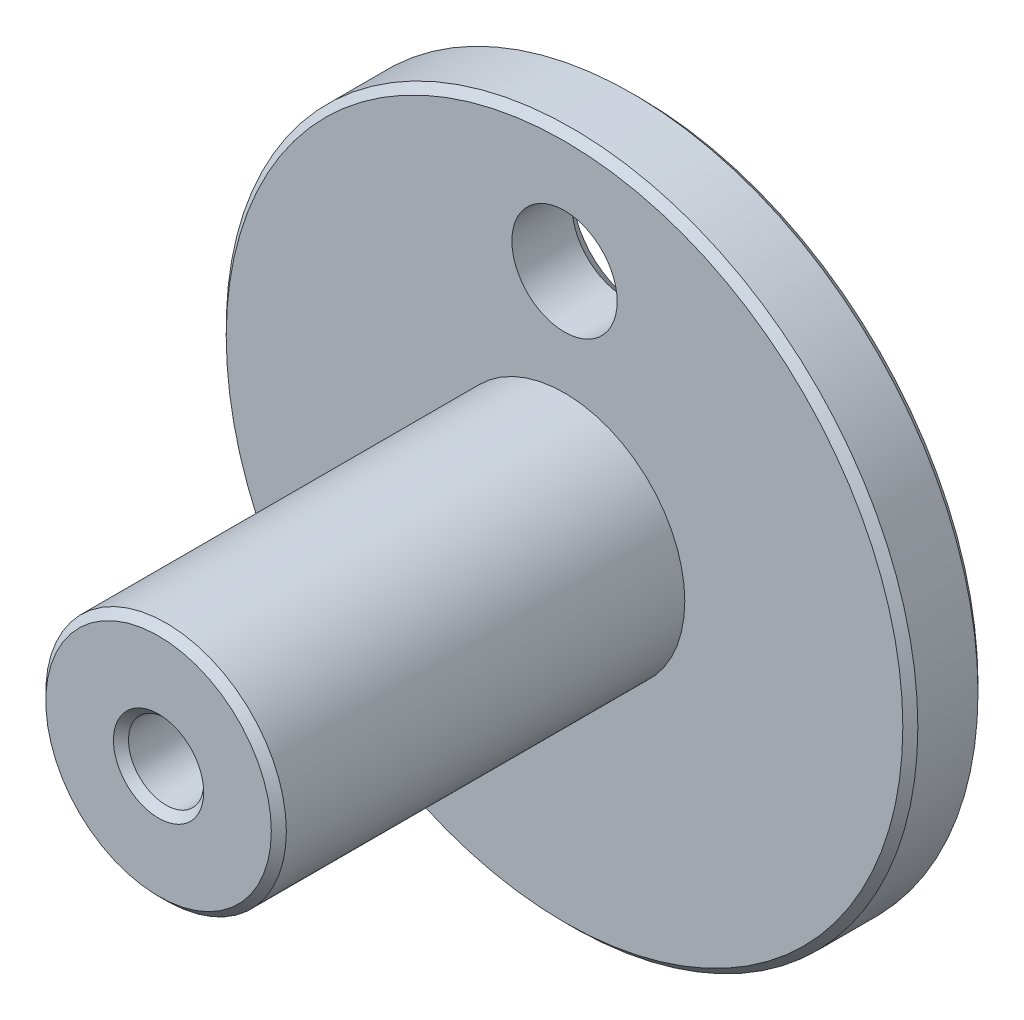
ISO-10303-21;
HEADER;
FILE_DESCRIPTION(('STEP AP214'),'2;1');
FILE_NAME('part.step','',(''),(''),'','','');
FILE_SCHEMA(('AUTOMOTIVE_DESIGN { 1 0 10303 214 1 1 1 1 }'));
ENDSEC;
DATA;
#1=APPLICATION_CONTEXT('core data for automotive mechanical design processes');
#2=APPLICATION_PROTOCOL_DEFINITION('international standard','automotive_design',2000,#1);
#3=PRODUCT_CONTEXT('',#1,'mechanical');
#4=PRODUCT('Part','Part','',(#3));
#5=PRODUCT_RELATED_PRODUCT_CATEGORY('part','',(#4));
#6=PRODUCT_DEFINITION_FORMATION('','',#4);
#7=PRODUCT_DEFINITION_CONTEXT('part definition',#1,'design');
#8=PRODUCT_DEFINITION('design','',#6,#7);
#9=PRODUCT_DEFINITION_SHAPE('','',#8);
#10=(LENGTH_UNIT() NAMED_UNIT(*) SI_UNIT(.MILLI.,.METRE.));
#11=(NAMED_UNIT(*) PLANE_ANGLE_UNIT() SI_UNIT($,.RADIAN.));
#12=(NAMED_UNIT(*) SI_UNIT($,.STERADIAN.) SOLID_ANGLE_UNIT());
#13=UNCERTAINTY_MEASURE_WITH_UNIT(LENGTH_MEASURE(1.E-05),#10,'distance_accuracy_value','');
#14=(GEOMETRIC_REPRESENTATION_CONTEXT(3) GLOBAL_UNCERTAINTY_ASSIGNED_CONTEXT((#13)) GLOBAL_UNIT_ASSIGNED_CONTEXT((#10,
#11,#12)) REPRESENTATION_CONTEXT('',''));
#15=CARTESIAN_POINT('',(0.,0.,0.));
#16=DIRECTION('',(0.,0.,1.));
#17=DIRECTION('',(1.,0.,0.));
#18=AXIS2_PLACEMENT_3D('',#15,#16,#17);
#19=CARTESIAN_POINT('',(0.,0.,5.));
#20=DIRECTION('',(0.,0.,1.));
#21=DIRECTION('',(1.,0.,0.));
#22=AXIS2_PLACEMENT_3D('',#19,#20,#21);
#23=PLANE('',#22);
#24=CARTESIAN_POINT('',(0.,0.,5.));
#25=DIRECTION('',(0.,0.,1.));
#26=DIRECTION('',(1.,0.,0.));
#27=AXIS2_PLACEMENT_3D('',#24,#25,#26);
#28=CIRCLE('',#27,22.5);
#29=CARTESIAN_POINT('',(22.5,0.,5.));
#30=VERTEX_POINT('',#29);
#31=EDGE_CURVE('E10',#30,#30,#28,.T.);
#32=ORIENTED_EDGE('',*,*,#31,.T.);
#33=EDGE_LOOP('',(#32));
#34=FACE_BOUND('',#33,.T.);
#35=CARTESIAN_POINT('',(0.,0.,5.));
#36=DIRECTION('',(0.,0.,1.));
#37=DIRECTION('',(1.,0.,0.));
#38=AXIS2_PLACEMENT_3D('',#35,#36,#37);
#39=CIRCLE('',#38,8.);
#40=CARTESIAN_POINT('',(8.,0.,5.));
#41=VERTEX_POINT('',#40);
#42=EDGE_CURVE('E82',#41,#41,#39,.T.);
#43=ORIENTED_EDGE('',*,*,#42,.F.);
#44=EDGE_LOOP('',(#43));
#45=FACE_BOUND('',#44,.T.);
#46=CARTESIAN_POINT('',(0.,15.,5.));
#47=DIRECTION('',(0.,0.,1.));
#48=DIRECTION('',(1.,0.,0.));
#49=AXIS2_PLACEMENT_3D('',#46,#47,#48);
#50=CIRCLE('',#49,3.5);
#51=CARTESIAN_POINT('',(3.5,15.,5.));
#52=VERTEX_POINT('',#51);
#53=EDGE_CURVE('E86',#52,#52,#50,.T.);
#54=ORIENTED_EDGE('',*,*,#53,.F.);
#55=EDGE_LOOP('',(#54));
#56=FACE_BOUND('',#55,.T.);
#57=ADVANCED_FACE('F41',(#34,#45,#56),#23,.T.);
#58=CARTESIAN_POINT('',(0.,0.,0.));
#59=DIRECTION('',(0.,0.,1.));
#60=DIRECTION('',(1.,0.,0.));
#61=AXIS2_PLACEMENT_3D('',#58,#59,#60);
#62=PLANE('',#61);
#63=CARTESIAN_POINT('',(0.,15.,0.));
#64=DIRECTION('',(0.,0.,-1.));
#65=DIRECTION('',(-1.,0.,0.));
#66=AXIS2_PLACEMENT_3D('',#63,#64,#65);
#67=CIRCLE('',#66,4.5);
#68=CARTESIAN_POINT('',(-4.5,15.,0.));
#69=VERTEX_POINT('',#68);
#70=EDGE_CURVE('E98',#69,#69,#67,.T.);
#71=ORIENTED_EDGE('',*,*,#70,.F.);
#72=EDGE_LOOP('',(#71));
#73=FACE_BOUND('',#72,.T.);
#74=CARTESIAN_POINT('',(0.,0.,0.));
#75=DIRECTION('',(0.,0.,1.));
#76=DIRECTION('',(1.,0.,0.));
#77=AXIS2_PLACEMENT_3D('',#74,#75,#76);
#78=CIRCLE('',#77,22.5);
#79=CARTESIAN_POINT('',(22.5,0.,0.));
#80=VERTEX_POINT('',#79);
#81=EDGE_CURVE('E50',#80,#80,#78,.F.);
#82=ORIENTED_EDGE('',*,*,#81,.T.);
#83=EDGE_LOOP('',(#82));
#84=FACE_BOUND('',#83,.T.);
#85=CARTESIAN_POINT('',(0.,0.,0.));
#86=DIRECTION('',(0.,0.,1.));
#87=DIRECTION('',(1.,0.,0.));
#88=AXIS2_PLACEMENT_3D('',#85,#86,#87);
#89=CIRCLE('',#88,2.5);
#90=CARTESIAN_POINT('',(2.5,0.,0.));
#91=VERTEX_POINT('',#90);
#92=EDGE_CURVE('E90',#91,#91,#89,.T.);
#93=ORIENTED_EDGE('',*,*,#92,.T.);
#94=EDGE_LOOP('',(#93));
#95=FACE_BOUND('',#94,.T.);
#96=ADVANCED_FACE('F105',(#73,#84,#95),#62,.F.);
#97=CARTESIAN_POINT('',(0.,0.,5.));
#98=DIRECTION('',(0.,0.,-1.));
#99=DIRECTION('',(-1.,0.,0.));
#100=AXIS2_PLACEMENT_3D('',#97,#98,#99);
#101=CYLINDRICAL_SURFACE('',#100,23.);
#102=CARTESIAN_POINT('',(0.,0.,0.499999999999994));
#103=DIRECTION('',(0.,0.,1.));
#104=DIRECTION('',(1.,0.,0.));
#105=AXIS2_PLACEMENT_3D('',#102,#103,#104);
#106=CIRCLE('',#105,23.);
#107=CARTESIAN_POINT('',(23.,0.,0.499999999999994));
#108=VERTEX_POINT('',#107);
#109=EDGE_CURVE('E55',#108,#108,#106,.T.);
#110=ORIENTED_EDGE('',*,*,#109,.T.);
#111=EDGE_LOOP('',(#110));
#112=FACE_BOUND('',#111,.T.);
#113=CARTESIAN_POINT('',(0.,0.,4.49999999999999));
#114=DIRECTION('',(0.,0.,1.));
#115=DIRECTION('',(1.,0.,0.));
#116=AXIS2_PLACEMENT_3D('',#113,#114,#115);
#117=CIRCLE('',#116,23.);
#118=CARTESIAN_POINT('',(23.,0.,4.49999999999999));
#119=VERTEX_POINT('',#118);
#120=EDGE_CURVE('E60',#119,#119,#117,.F.);
#121=ORIENTED_EDGE('',*,*,#120,.T.);
#122=EDGE_LOOP('',(#121));
#123=FACE_BOUND('',#122,.T.);
#124=ADVANCED_FACE('F107',(#112,#123),#101,.T.);
#125=CARTESIAN_POINT('',(0.,15.,5.));
#126=DIRECTION('',(0.,0.,-1.));
#127=DIRECTION('',(-1.,0.,0.));
#128=AXIS2_PLACEMENT_3D('',#125,#126,#127);
#129=CYLINDRICAL_SURFACE('',#128,3.5);
#130=CARTESIAN_POINT('',(0.,15.,1.00000000000003));
#131=DIRECTION('',(0.,0.,-1.));
#132=DIRECTION('',(-1.,0.,0.));
#133=AXIS2_PLACEMENT_3D('',#130,#131,#132);
#134=CIRCLE('',#133,3.49999999999999);
#135=CARTESIAN_POINT('',(-3.49999999999999,15.,1.00000000000003));
#136=VERTEX_POINT('',#135);
#137=EDGE_CURVE('E94',#136,#136,#134,.T.);
#138=ORIENTED_EDGE('',*,*,#137,.T.);
#139=EDGE_LOOP('',(#138));
#140=FACE_BOUND('',#139,.T.);
#141=ORIENTED_EDGE('',*,*,#53,.T.);
#142=EDGE_LOOP('',(#141));
#143=FACE_BOUND('',#142,.T.);
#144=ADVANCED_FACE('F135',(#140,#143),#129,.F.);
#145=CARTESIAN_POINT('',(0.,0.,32.));
#146=DIRECTION('',(0.,0.,-1.));
#147=DIRECTION('',(-1.,0.,0.));
#148=AXIS2_PLACEMENT_3D('',#145,#146,#147);
#149=CYLINDRICAL_SURFACE('',#148,8.);
#150=CARTESIAN_POINT('',(0.,0.,31.5));
#151=DIRECTION('',(0.,0.,1.));
#152=DIRECTION('',(1.,0.,0.));
#153=AXIS2_PLACEMENT_3D('',#150,#151,#152);
#154=CIRCLE('',#153,8.);
#155=CARTESIAN_POINT('',(8.,0.,31.5));
#156=VERTEX_POINT('',#155);
#157=EDGE_CURVE('E70',#156,#156,#154,.F.);
#158=ORIENTED_EDGE('',*,*,#157,.T.);
#159=EDGE_LOOP('',(#158));
#160=FACE_BOUND('',#159,.T.);
#161=ORIENTED_EDGE('',*,*,#42,.T.);
#162=EDGE_LOOP('',(#161));
#163=FACE_BOUND('',#162,.T.);
#164=ADVANCED_FACE('F125',(#160,#163),#149,.T.);
#165=CARTESIAN_POINT('',(0.,0.,32.));
#166=DIRECTION('',(0.,0.,1.));
#167=DIRECTION('',(1.,0.,0.));
#168=AXIS2_PLACEMENT_3D('',#165,#166,#167);
#169=PLANE('',#168);
#170=CARTESIAN_POINT('',(0.,0.,32.));
#171=DIRECTION('',(0.,0.,1.));
#172=DIRECTION('',(1.,0.,0.));
#173=AXIS2_PLACEMENT_3D('',#170,#171,#172);
#174=CIRCLE('',#173,7.50000000000001);
#175=CARTESIAN_POINT('',(7.50000000000001,0.,32.));
#176=VERTEX_POINT('',#175);
#177=EDGE_CURVE('E74',#176,#176,#174,.T.);
#178=ORIENTED_EDGE('',*,*,#177,.T.);
#179=EDGE_LOOP('',(#178));
#180=FACE_BOUND('',#179,.T.);
#181=CARTESIAN_POINT('',(0.,0.,32.));
#182=DIRECTION('',(0.,0.,1.));
#183=DIRECTION('',(1.,0.,0.));
#184=AXIS2_PLACEMENT_3D('',#181,#182,#183);
#185=CIRCLE('',#184,2.99999999999999);
#186=CARTESIAN_POINT('',(2.99999999999999,0.,32.));
#187=VERTEX_POINT('',#186);
#188=EDGE_CURVE('E78',#187,#187,#185,.F.);
#189=ORIENTED_EDGE('',*,*,#188,.T.);
#190=EDGE_LOOP('',(#189));
#191=FACE_BOUND('',#190,.T.);
#192=ADVANCED_FACE('F115',(#180,#191),#169,.T.);
#193=CARTESIAN_POINT('',(0.,0.,-5.));
#194=DIRECTION('',(0.,0.,1.));
#195=DIRECTION('',(1.,0.,0.));
#196=AXIS2_PLACEMENT_3D('',#193,#194,#195);
#197=CYLINDRICAL_SURFACE('',#196,2.5);
#198=CARTESIAN_POINT('',(0.,0.,31.5));
#199=DIRECTION('',(0.,0.,1.));
#200=DIRECTION('',(1.,0.,0.));
#201=AXIS2_PLACEMENT_3D('',#198,#199,#200);
#202=CIRCLE('',#201,2.5);
#203=CARTESIAN_POINT('',(2.5,0.,31.5));
#204=VERTEX_POINT('',#203);
#205=EDGE_CURVE('E66',#204,#204,#202,.T.);
#206=ORIENTED_EDGE('',*,*,#205,.T.);
#207=EDGE_LOOP('',(#206));
#208=FACE_BOUND('',#207,.T.);
#209=ORIENTED_EDGE('',*,*,#92,.F.);
#210=EDGE_LOOP('',(#209));
#211=FACE_BOUND('',#210,.T.);
#212=ADVANCED_FACE('F112',(#208,#211),#197,.F.);
#213=CARTESIAN_POINT('',(0.,0.,32.));
#214=DIRECTION('',(0.,0.,-1.));
#215=DIRECTION('',(-1.,0.,0.));
#216=AXIS2_PLACEMENT_3D('',#213,#214,#215);
#217=CONICAL_SURFACE('',#216,7.50000000000001,0.785398163397441);
#218=ORIENTED_EDGE('',*,*,#157,.F.);
#219=EDGE_LOOP('',(#218));
#220=FACE_BOUND('',#219,.T.);
#221=ORIENTED_EDGE('',*,*,#177,.F.);
#222=EDGE_LOOP('',(#221));
#223=FACE_BOUND('',#222,.T.);
#224=ADVANCED_FACE('F114',(#220,#223),#217,.T.);
#225=CARTESIAN_POINT('',(0.,0.,31.5));
#226=DIRECTION('',(0.,0.,1.));
#227=DIRECTION('',(1.,0.,0.));
#228=AXIS2_PLACEMENT_3D('',#225,#226,#227);
#229=CONICAL_SURFACE('',#228,2.5,0.785398163397444);
#230=ORIENTED_EDGE('',*,*,#188,.F.);
#231=EDGE_LOOP('',(#230));
#232=FACE_BOUND('',#231,.T.);
#233=ORIENTED_EDGE('',*,*,#205,.F.);
#234=EDGE_LOOP('',(#233));
#235=FACE_BOUND('',#234,.T.);
#236=ADVANCED_FACE('F122',(#232,#235),#229,.F.);
#237=CARTESIAN_POINT('',(0.,0.,0.499999999999994));
#238=DIRECTION('',(0.,0.,1.));
#239=DIRECTION('',(1.,0.,0.));
#240=AXIS2_PLACEMENT_3D('',#237,#238,#239);
#241=CONICAL_SURFACE('',#240,23.,0.785398163397455);
#242=ORIENTED_EDGE('',*,*,#81,.F.);
#243=EDGE_LOOP('',(#242));
#244=FACE_BOUND('',#243,.T.);
#245=ORIENTED_EDGE('',*,*,#109,.F.);
#246=EDGE_LOOP('',(#245));
#247=FACE_BOUND('',#246,.T.);
#248=ADVANCED_FACE('F149',(#244,#247),#241,.T.);
#249=CARTESIAN_POINT('',(0.,0.,5.));
#250=DIRECTION('',(0.,0.,-1.));
#251=DIRECTION('',(-1.,0.,0.));
#252=AXIS2_PLACEMENT_3D('',#249,#250,#251);
#253=CONICAL_SURFACE('',#252,22.5,0.785398163397434);
#254=ORIENTED_EDGE('',*,*,#120,.F.);
#255=EDGE_LOOP('',(#254));
#256=FACE_BOUND('',#255,.T.);
#257=ORIENTED_EDGE('',*,*,#31,.F.);
#258=EDGE_LOOP('',(#257));
#259=FACE_BOUND('',#258,.T.);
#260=ADVANCED_FACE('F44',(#256,#259),#253,.T.);
#261=CARTESIAN_POINT('',(0.,15.,0.));
#262=DIRECTION('',(0.,0.,-1.));
#263=DIRECTION('',(-1.,0.,0.));
#264=AXIS2_PLACEMENT_3D('',#261,#262,#263);
#265=CONICAL_SURFACE('',#264,4.5,0.78539816339744);
#266=ORIENTED_EDGE('',*,*,#137,.F.);
#267=EDGE_LOOP('',(#266));
#268=FACE_BOUND('',#267,.T.);
#269=ORIENTED_EDGE('',*,*,#70,.T.);
#270=EDGE_LOOP('',(#269));
#271=FACE_BOUND('',#270,.T.);
#272=ADVANCED_FACE('F103',(#268,#271),#265,.F.);
#273=CLOSED_SHELL('',(#57,#96,#124,#144,#164,#192,#212,#224,#236,#248,#260,#272));
#274=MANIFOLD_SOLID_BREP('B2',#273);
#275=ADVANCED_BREP_SHAPE_REPRESENTATION('',(#18,#274),#14);
#276=SHAPE_DEFINITION_REPRESENTATION(#9,#275);
ENDSEC;
END-ISO-10303-21;
